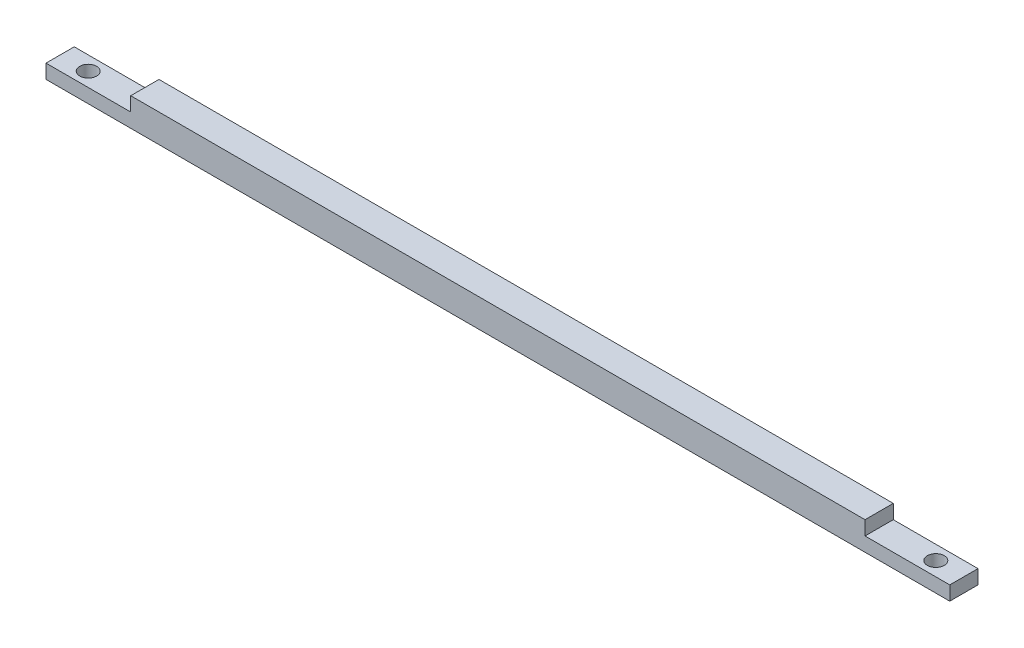
ISO-10303-21;
HEADER;
FILE_DESCRIPTION(('STEP AP214'),'2;1');
FILE_NAME('part.step','',(''),(''),'','','');
FILE_SCHEMA(('AUTOMOTIVE_DESIGN { 1 0 10303 214 1 1 1 1 }'));
ENDSEC;
DATA;
#1=APPLICATION_CONTEXT('core data for automotive mechanical design processes');
#2=APPLICATION_PROTOCOL_DEFINITION('international standard','automotive_design',2000,#1);
#3=PRODUCT_CONTEXT('',#1,'mechanical');
#4=PRODUCT('Part','Part','',(#3));
#5=PRODUCT_RELATED_PRODUCT_CATEGORY('part','',(#4));
#6=PRODUCT_DEFINITION_FORMATION('','',#4);
#7=PRODUCT_DEFINITION_CONTEXT('part definition',#1,'design');
#8=PRODUCT_DEFINITION('design','',#6,#7);
#9=PRODUCT_DEFINITION_SHAPE('','',#8);
#10=(LENGTH_UNIT() NAMED_UNIT(*) SI_UNIT(.MILLI.,.METRE.));
#11=(NAMED_UNIT(*) PLANE_ANGLE_UNIT() SI_UNIT($,.RADIAN.));
#12=(NAMED_UNIT(*) SI_UNIT($,.STERADIAN.) SOLID_ANGLE_UNIT());
#13=UNCERTAINTY_MEASURE_WITH_UNIT(LENGTH_MEASURE(1.E-05),#10,'distance_accuracy_value','');
#14=(GEOMETRIC_REPRESENTATION_CONTEXT(3) GLOBAL_UNCERTAINTY_ASSIGNED_CONTEXT((#13)) GLOBAL_UNIT_ASSIGNED_CONTEXT((#10,
#11,#12)) REPRESENTATION_CONTEXT('',''));
#15=CARTESIAN_POINT('',(0.,0.,0.));
#16=DIRECTION('',(0.,0.,1.));
#17=DIRECTION('',(1.,0.,0.));
#18=AXIS2_PLACEMENT_3D('',#15,#16,#17);
#19=CARTESIAN_POINT('',(-80.,2.5,5.));
#20=DIRECTION('',(1.,0.,0.));
#21=DIRECTION('',(0.,0.,-1.));
#22=AXIS2_PLACEMENT_3D('',#19,#20,#21);
#23=PLANE('',#22);
#24=DIRECTION('',(0.,0.,1.));
#25=VECTOR('',#24,1.);
#26=CARTESIAN_POINT('',(-80.,0.,0.));
#27=LINE('',#26,#25);
#28=CARTESIAN_POINT('',(-80.,0.,0.));
#29=VERTEX_POINT('',#28);
#30=CARTESIAN_POINT('',(-80.,0.,5.));
#31=VERTEX_POINT('',#30);
#32=EDGE_CURVE('E104',#29,#31,#27,.T.);
#33=ORIENTED_EDGE('',*,*,#32,.F.);
#34=DIRECTION('',(0.,-1.,0.));
#35=VECTOR('',#34,1.);
#36=CARTESIAN_POINT('',(-80.,2.5,0.));
#37=LINE('',#36,#35);
#38=CARTESIAN_POINT('',(-80.,-2.5,0.));
#39=VERTEX_POINT('',#38);
#40=EDGE_CURVE('E146',#29,#39,#37,.T.);
#41=ORIENTED_EDGE('',*,*,#40,.T.);
#42=DIRECTION('',(0.,0.,-1.));
#43=VECTOR('',#42,1.);
#44=CARTESIAN_POINT('',(-80.,-2.5,5.));
#45=LINE('',#44,#43);
#46=CARTESIAN_POINT('',(-80.,-2.5,5.));
#47=VERTEX_POINT('',#46);
#48=EDGE_CURVE('E11',#47,#39,#45,.T.);
#49=ORIENTED_EDGE('',*,*,#48,.F.);
#50=DIRECTION('',(0.,-1.,0.));
#51=VECTOR('',#50,1.);
#52=CARTESIAN_POINT('',(-80.,2.5,5.));
#53=LINE('',#52,#51);
#54=EDGE_CURVE('E119',#31,#47,#53,.T.);
#55=ORIENTED_EDGE('',*,*,#54,.F.);
#56=EDGE_LOOP('',(#33,#41,#49,#55));
#57=FACE_BOUND('',#56,.T.);
#58=ADVANCED_FACE('F39',(#57),#23,.F.);
#59=CARTESIAN_POINT('',(80.,2.5,5.));
#60=DIRECTION('',(-1.,0.,0.));
#61=DIRECTION('',(0.,0.,1.));
#62=AXIS2_PLACEMENT_3D('',#59,#60,#61);
#63=PLANE('',#62);
#64=DIRECTION('',(0.,1.,0.));
#65=VECTOR('',#64,1.);
#66=CARTESIAN_POINT('',(80.,2.5,0.));
#67=LINE('',#66,#65);
#68=CARTESIAN_POINT('',(80.,-2.5,0.));
#69=VERTEX_POINT('',#68);
#70=CARTESIAN_POINT('',(80.,0.,0.));
#71=VERTEX_POINT('',#70);
#72=EDGE_CURVE('E137',#69,#71,#67,.T.);
#73=ORIENTED_EDGE('',*,*,#72,.T.);
#74=DIRECTION('',(0.,0.,-1.));
#75=VECTOR('',#74,1.);
#76=CARTESIAN_POINT('',(80.,0.,0.));
#77=LINE('',#76,#75);
#78=CARTESIAN_POINT('',(80.,0.,5.));
#79=VERTEX_POINT('',#78);
#80=EDGE_CURVE('E63',#79,#71,#77,.T.);
#81=ORIENTED_EDGE('',*,*,#80,.F.);
#82=DIRECTION('',(0.,1.,0.));
#83=VECTOR('',#82,1.);
#84=CARTESIAN_POINT('',(80.,2.5,5.));
#85=LINE('',#84,#83);
#86=CARTESIAN_POINT('',(80.,-2.5,5.));
#87=VERTEX_POINT('',#86);
#88=EDGE_CURVE('E133',#87,#79,#85,.T.);
#89=ORIENTED_EDGE('',*,*,#88,.F.);
#90=DIRECTION('',(0.,0.,-1.));
#91=VECTOR('',#90,1.);
#92=CARTESIAN_POINT('',(80.,-2.5,5.));
#93=LINE('',#92,#91);
#94=EDGE_CURVE('E48',#87,#69,#93,.T.);
#95=ORIENTED_EDGE('',*,*,#94,.T.);
#96=EDGE_LOOP('',(#73,#81,#89,#95));
#97=FACE_BOUND('',#96,.T.);
#98=ADVANCED_FACE('F41',(#97),#63,.F.);
#99=CARTESIAN_POINT('',(-80.,2.5,5.));
#100=DIRECTION('',(0.,-1.,0.));
#101=DIRECTION('',(0.,0.,-1.));
#102=AXIS2_PLACEMENT_3D('',#99,#100,#101);
#103=PLANE('',#102);
#104=DIRECTION('',(-1.,0.,0.));
#105=VECTOR('',#104,1.);
#106=CARTESIAN_POINT('',(-80.,2.5,0.));
#107=LINE('',#106,#105);
#108=CARTESIAN_POINT('',(65.,2.5,0.));
#109=VERTEX_POINT('',#108);
#110=CARTESIAN_POINT('',(-65.,2.5,0.));
#111=VERTEX_POINT('',#110);
#112=EDGE_CURVE('E141',#109,#111,#107,.T.);
#113=ORIENTED_EDGE('',*,*,#112,.T.);
#114=DIRECTION('',(0.,0.,-1.));
#115=VECTOR('',#114,1.);
#116=CARTESIAN_POINT('',(-65.,2.5,0.));
#117=LINE('',#116,#115);
#118=CARTESIAN_POINT('',(-65.,2.5,5.));
#119=VERTEX_POINT('',#118);
#120=EDGE_CURVE('E115',#119,#111,#117,.T.);
#121=ORIENTED_EDGE('',*,*,#120,.F.);
#122=DIRECTION('',(-1.,0.,0.));
#123=VECTOR('',#122,1.);
#124=CARTESIAN_POINT('',(-80.,2.5,5.));
#125=LINE('',#124,#123);
#126=CARTESIAN_POINT('',(65.,2.5,4.99999999999998));
#127=VERTEX_POINT('',#126);
#128=EDGE_CURVE('E128',#127,#119,#125,.T.);
#129=ORIENTED_EDGE('',*,*,#128,.F.);
#130=DIRECTION('',(0.,0.,1.));
#131=VECTOR('',#130,1.);
#132=CARTESIAN_POINT('',(65.,2.5,0.));
#133=LINE('',#132,#131);
#134=EDGE_CURVE('E174',#109,#127,#133,.T.);
#135=ORIENTED_EDGE('',*,*,#134,.F.);
#136=EDGE_LOOP('',(#113,#121,#129,#135));
#137=FACE_BOUND('',#136,.T.);
#138=ADVANCED_FACE('F192',(#137),#103,.F.);
#139=CARTESIAN_POINT('',(-80.,-2.5,5.));
#140=DIRECTION('',(0.,1.,0.));
#141=DIRECTION('',(0.,0.,1.));
#142=AXIS2_PLACEMENT_3D('',#139,#140,#141);
#143=PLANE('',#142);
#144=CARTESIAN_POINT('',(-75.0309164461181,-2.5,2.49985437879386));
#145=DIRECTION('',(0.,1.,0.));
#146=DIRECTION('',(0.,0.,1.));
#147=AXIS2_PLACEMENT_3D('',#144,#145,#146);
#148=CIRCLE('',#147,1.5);
#149=CARTESIAN_POINT('',(-75.0309164461181,-2.5,3.99985437879385));
#150=VERTEX_POINT('',#149);
#151=EDGE_CURVE('E182',#150,#150,#148,.T.);
#152=ORIENTED_EDGE('',*,*,#151,.T.);
#153=EDGE_LOOP('',(#152));
#154=FACE_BOUND('',#153,.T.);
#155=CARTESIAN_POINT('',(75.0309164461181,-2.5,2.49985437879386));
#156=DIRECTION('',(0.,1.,0.));
#157=DIRECTION('',(0.,0.,-1.));
#158=AXIS2_PLACEMENT_3D('',#155,#156,#157);
#159=CIRCLE('',#158,1.5);
#160=CARTESIAN_POINT('',(75.0309164461181,-2.5,0.999854378793859));
#161=VERTEX_POINT('',#160);
#162=EDGE_CURVE('E299',#161,#161,#159,.T.);
#163=ORIENTED_EDGE('',*,*,#162,.T.);
#164=EDGE_LOOP('',(#163));
#165=FACE_BOUND('',#164,.T.);
#166=DIRECTION('',(1.,0.,0.));
#167=VECTOR('',#166,1.);
#168=CARTESIAN_POINT('',(-80.,-2.5,0.));
#169=LINE('',#168,#167);
#170=EDGE_CURVE('E149',#39,#69,#169,.T.);
#171=ORIENTED_EDGE('',*,*,#170,.T.);
#172=ORIENTED_EDGE('',*,*,#94,.F.);
#173=DIRECTION('',(1.,0.,0.));
#174=VECTOR('',#173,1.);
#175=CARTESIAN_POINT('',(-80.,-2.5,5.));
#176=LINE('',#175,#174);
#177=EDGE_CURVE('E127',#47,#87,#176,.T.);
#178=ORIENTED_EDGE('',*,*,#177,.F.);
#179=ORIENTED_EDGE('',*,*,#48,.T.);
#180=EDGE_LOOP('',(#171,#172,#178,#179));
#181=FACE_BOUND('',#180,.T.);
#182=ADVANCED_FACE('F190',(#154,#165,#181),#143,.F.);
#183=CARTESIAN_POINT('',(0.,0.,5.));
#184=DIRECTION('',(0.,0.,1.));
#185=DIRECTION('',(1.,0.,0.));
#186=AXIS2_PLACEMENT_3D('',#183,#184,#185);
#187=PLANE('',#186);
#188=DIRECTION('',(0.,1.,0.));
#189=VECTOR('',#188,1.);
#190=CARTESIAN_POINT('',(-65.,0.,5.));
#191=LINE('',#190,#189);
#192=CARTESIAN_POINT('',(-65.,0.,5.));
#193=VERTEX_POINT('',#192);
#194=EDGE_CURVE('E122',#193,#119,#191,.T.);
#195=ORIENTED_EDGE('',*,*,#194,.F.);
#196=DIRECTION('',(1.,0.,0.));
#197=VECTOR('',#196,1.);
#198=CARTESIAN_POINT('',(-80.,0.,5.));
#199=LINE('',#198,#197);
#200=EDGE_CURVE('E107',#31,#193,#199,.T.);
#201=ORIENTED_EDGE('',*,*,#200,.F.);
#202=ORIENTED_EDGE('',*,*,#54,.T.);
#203=ORIENTED_EDGE('',*,*,#177,.T.);
#204=ORIENTED_EDGE('',*,*,#88,.T.);
#205=DIRECTION('',(1.,0.,0.));
#206=VECTOR('',#205,1.);
#207=CARTESIAN_POINT('',(80.,0.,5.));
#208=LINE('',#207,#206);
#209=CARTESIAN_POINT('',(65.,0.,4.99999999999998));
#210=VERTEX_POINT('',#209);
#211=EDGE_CURVE('E172',#210,#79,#208,.T.);
#212=ORIENTED_EDGE('',*,*,#211,.F.);
#213=DIRECTION('',(0.,1.,0.));
#214=VECTOR('',#213,1.);
#215=CARTESIAN_POINT('',(65.,0.,4.99999999999998));
#216=LINE('',#215,#214);
#217=EDGE_CURVE('E183',#210,#127,#216,.T.);
#218=ORIENTED_EDGE('',*,*,#217,.T.);
#219=ORIENTED_EDGE('',*,*,#128,.T.);
#220=EDGE_LOOP('',(#195,#201,#202,#203,#204,#212,#218,#219));
#221=FACE_BOUND('',#220,.T.);
#222=ADVANCED_FACE('F118',(#221),#187,.T.);
#223=CARTESIAN_POINT('',(0.,0.,0.));
#224=DIRECTION('',(0.,0.,1.));
#225=DIRECTION('',(1.,0.,0.));
#226=AXIS2_PLACEMENT_3D('',#223,#224,#225);
#227=PLANE('',#226);
#228=DIRECTION('',(-1.,0.,0.));
#229=VECTOR('',#228,1.);
#230=CARTESIAN_POINT('',(-80.,0.,0.));
#231=LINE('',#230,#229);
#232=CARTESIAN_POINT('',(-65.,0.,0.));
#233=VERTEX_POINT('',#232);
#234=EDGE_CURVE('E110',#233,#29,#231,.T.);
#235=ORIENTED_EDGE('',*,*,#234,.F.);
#236=DIRECTION('',(0.,1.,0.));
#237=VECTOR('',#236,1.);
#238=CARTESIAN_POINT('',(-65.,0.,0.));
#239=LINE('',#238,#237);
#240=EDGE_CURVE('E142',#233,#111,#239,.T.);
#241=ORIENTED_EDGE('',*,*,#240,.T.);
#242=ORIENTED_EDGE('',*,*,#112,.F.);
#243=DIRECTION('',(0.,1.,0.));
#244=VECTOR('',#243,1.);
#245=CARTESIAN_POINT('',(65.,0.,0.));
#246=LINE('',#245,#244);
#247=CARTESIAN_POINT('',(65.,0.,0.));
#248=VERTEX_POINT('',#247);
#249=EDGE_CURVE('E165',#248,#109,#246,.T.);
#250=ORIENTED_EDGE('',*,*,#249,.F.);
#251=DIRECTION('',(-1.,0.,0.));
#252=VECTOR('',#251,1.);
#253=CARTESIAN_POINT('',(80.,0.,0.));
#254=LINE('',#253,#252);
#255=EDGE_CURVE('E163',#71,#248,#254,.T.);
#256=ORIENTED_EDGE('',*,*,#255,.F.);
#257=ORIENTED_EDGE('',*,*,#72,.F.);
#258=ORIENTED_EDGE('',*,*,#170,.F.);
#259=ORIENTED_EDGE('',*,*,#40,.F.);
#260=EDGE_LOOP('',(#235,#241,#242,#250,#256,#257,#258,#259));
#261=FACE_BOUND('',#260,.T.);
#262=ADVANCED_FACE('F161',(#261),#227,.F.);
#263=CARTESIAN_POINT('',(65.,0.,0.));
#264=DIRECTION('',(-1.,0.,0.));
#265=DIRECTION('',(0.,0.,1.));
#266=AXIS2_PLACEMENT_3D('',#263,#264,#265);
#267=PLANE('',#266);
#268=ORIENTED_EDGE('',*,*,#134,.T.);
#269=ORIENTED_EDGE('',*,*,#217,.F.);
#270=DIRECTION('',(0.,0.,1.));
#271=VECTOR('',#270,1.);
#272=CARTESIAN_POINT('',(65.,0.,0.));
#273=LINE('',#272,#271);
#274=EDGE_CURVE('E168',#248,#210,#273,.T.);
#275=ORIENTED_EDGE('',*,*,#274,.F.);
#276=ORIENTED_EDGE('',*,*,#249,.T.);
#277=EDGE_LOOP('',(#268,#269,#275,#276));
#278=FACE_BOUND('',#277,.T.);
#279=ADVANCED_FACE('F231',(#278),#267,.F.);
#280=CARTESIAN_POINT('',(0.,0.,0.));
#281=DIRECTION('',(0.,-1.,0.));
#282=DIRECTION('',(0.,0.,-1.));
#283=AXIS2_PLACEMENT_3D('',#280,#281,#282);
#284=PLANE('',#283);
#285=CARTESIAN_POINT('',(75.0309164461181,0.,2.49985437879386));
#286=DIRECTION('',(0.,1.,0.));
#287=DIRECTION('',(0.,0.,-1.));
#288=AXIS2_PLACEMENT_3D('',#285,#286,#287);
#289=CIRCLE('',#288,1.5);
#290=CARTESIAN_POINT('',(75.0309164461181,0.,0.999854378793859));
#291=VERTEX_POINT('',#290);
#292=EDGE_CURVE('E302',#291,#291,#289,.T.);
#293=ORIENTED_EDGE('',*,*,#292,.F.);
#294=EDGE_LOOP('',(#293));
#295=FACE_BOUND('',#294,.T.);
#296=ORIENTED_EDGE('',*,*,#80,.T.);
#297=ORIENTED_EDGE('',*,*,#255,.T.);
#298=ORIENTED_EDGE('',*,*,#274,.T.);
#299=ORIENTED_EDGE('',*,*,#211,.T.);
#300=EDGE_LOOP('',(#296,#297,#298,#299));
#301=FACE_BOUND('',#300,.T.);
#302=ADVANCED_FACE('F240',(#295,#301),#284,.F.);
#303=CARTESIAN_POINT('',(-65.,0.,0.));
#304=DIRECTION('',(1.,0.,0.));
#305=DIRECTION('',(0.,0.,-1.));
#306=AXIS2_PLACEMENT_3D('',#303,#304,#305);
#307=PLANE('',#306);
#308=ORIENTED_EDGE('',*,*,#120,.T.);
#309=ORIENTED_EDGE('',*,*,#240,.F.);
#310=DIRECTION('',(0.,0.,-1.));
#311=VECTOR('',#310,1.);
#312=CARTESIAN_POINT('',(-65.,0.,0.));
#313=LINE('',#312,#311);
#314=EDGE_CURVE('E55',#193,#233,#313,.T.);
#315=ORIENTED_EDGE('',*,*,#314,.F.);
#316=ORIENTED_EDGE('',*,*,#194,.T.);
#317=EDGE_LOOP('',(#308,#309,#315,#316));
#318=FACE_BOUND('',#317,.T.);
#319=ADVANCED_FACE('F248',(#318),#307,.F.);
#320=CARTESIAN_POINT('',(0.,0.,0.));
#321=DIRECTION('',(0.,1.,0.));
#322=DIRECTION('',(0.,0.,1.));
#323=AXIS2_PLACEMENT_3D('',#320,#321,#322);
#324=PLANE('',#323);
#325=CARTESIAN_POINT('',(-75.0309164461181,0.,2.49985437879386));
#326=DIRECTION('',(0.,1.,0.));
#327=DIRECTION('',(0.,0.,1.));
#328=AXIS2_PLACEMENT_3D('',#325,#326,#327);
#329=CIRCLE('',#328,1.5);
#330=CARTESIAN_POINT('',(-75.0309164461181,0.,3.99985437879385));
#331=VERTEX_POINT('',#330);
#332=EDGE_CURVE('E306',#331,#331,#329,.T.);
#333=ORIENTED_EDGE('',*,*,#332,.F.);
#334=EDGE_LOOP('',(#333));
#335=FACE_BOUND('',#334,.T.);
#336=ORIENTED_EDGE('',*,*,#32,.T.);
#337=ORIENTED_EDGE('',*,*,#200,.T.);
#338=ORIENTED_EDGE('',*,*,#314,.T.);
#339=ORIENTED_EDGE('',*,*,#234,.T.);
#340=EDGE_LOOP('',(#336,#337,#338,#339));
#341=FACE_BOUND('',#340,.T.);
#342=ADVANCED_FACE('F106',(#335,#341),#324,.T.);
#343=CARTESIAN_POINT('',(-75.0309164461181,-2.5,2.49985437879386));
#344=DIRECTION('',(0.,1.,0.));
#345=DIRECTION('',(0.,0.,1.));
#346=AXIS2_PLACEMENT_3D('',#343,#344,#345);
#347=CYLINDRICAL_SURFACE('',#346,1.5);
#348=ORIENTED_EDGE('',*,*,#151,.F.);
#349=EDGE_LOOP('',(#348));
#350=FACE_BOUND('',#349,.T.);
#351=ORIENTED_EDGE('',*,*,#332,.T.);
#352=EDGE_LOOP('',(#351));
#353=FACE_BOUND('',#352,.T.);
#354=ADVANCED_FACE('F272',(#350,#353),#347,.F.);
#355=CARTESIAN_POINT('',(75.0309164461181,-2.5,2.49985437879386));
#356=DIRECTION('',(0.,1.,0.));
#357=DIRECTION('',(0.,0.,1.));
#358=AXIS2_PLACEMENT_3D('',#355,#356,#357);
#359=CYLINDRICAL_SURFACE('',#358,1.5);
#360=ORIENTED_EDGE('',*,*,#162,.F.);
#361=EDGE_LOOP('',(#360));
#362=FACE_BOUND('',#361,.T.);
#363=ORIENTED_EDGE('',*,*,#292,.T.);
#364=EDGE_LOOP('',(#363));
#365=FACE_BOUND('',#364,.T.);
#366=ADVANCED_FACE('F282',(#362,#365),#359,.F.);
#367=CLOSED_SHELL('',(#58,#98,#138,#182,#222,#262,#279,#302,#319,#342,#354,#366));
#368=MANIFOLD_SOLID_BREP('B2',#367);
#369=ADVANCED_BREP_SHAPE_REPRESENTATION('',(#18,#368),#14);
#370=SHAPE_DEFINITION_REPRESENTATION(#9,#369);
ENDSEC;
END-ISO-10303-21;
